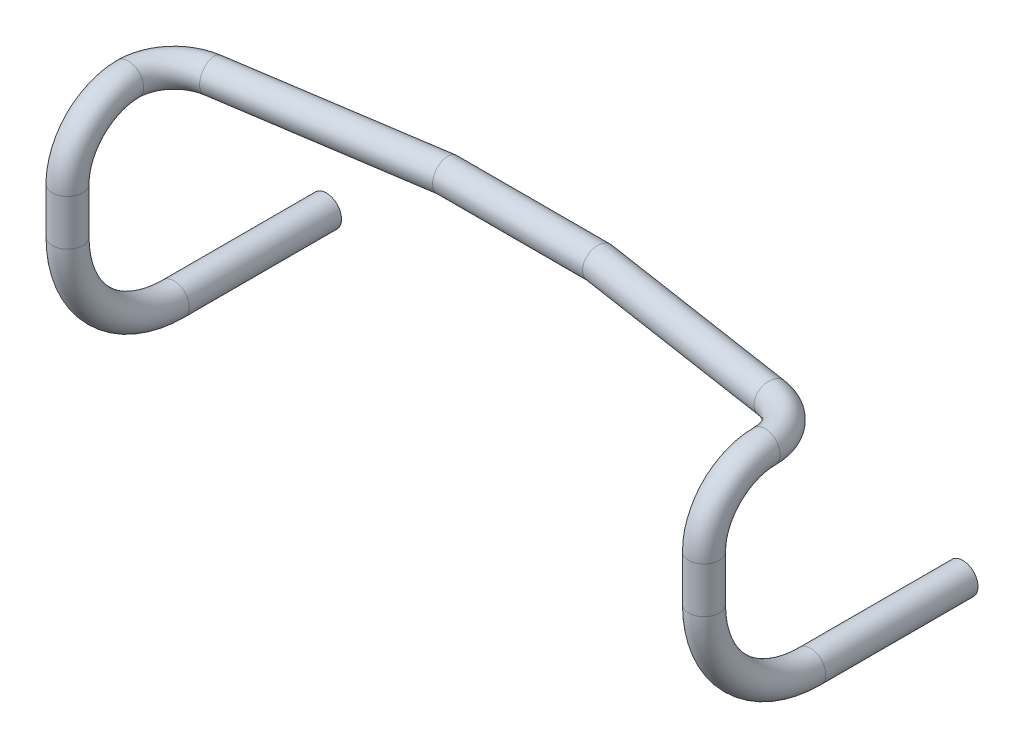
ISO-10303-21;
HEADER;
FILE_DESCRIPTION(('STEP AP214'),'2;1');
FILE_NAME('part.step','',(''),(''),'','','');
FILE_SCHEMA(('AUTOMOTIVE_DESIGN { 1 0 10303 214 1 1 1 1 }'));
ENDSEC;
DATA;
#1=APPLICATION_CONTEXT('core data for automotive mechanical design processes');
#2=APPLICATION_PROTOCOL_DEFINITION('international standard','automotive_design',2000,#1);
#3=PRODUCT_CONTEXT('',#1,'mechanical');
#4=PRODUCT('Part','Part','',(#3));
#5=PRODUCT_RELATED_PRODUCT_CATEGORY('part','',(#4));
#6=PRODUCT_DEFINITION_FORMATION('','',#4);
#7=PRODUCT_DEFINITION_CONTEXT('part definition',#1,'design');
#8=PRODUCT_DEFINITION('design','',#6,#7);
#9=PRODUCT_DEFINITION_SHAPE('','',#8);
#10=(LENGTH_UNIT() NAMED_UNIT(*) SI_UNIT(.MILLI.,.METRE.));
#11=(NAMED_UNIT(*) PLANE_ANGLE_UNIT() SI_UNIT($,.RADIAN.));
#12=(NAMED_UNIT(*) SI_UNIT($,.STERADIAN.) SOLID_ANGLE_UNIT());
#13=UNCERTAINTY_MEASURE_WITH_UNIT(LENGTH_MEASURE(1.E-05),#10,'distance_accuracy_value','');
#14=(GEOMETRIC_REPRESENTATION_CONTEXT(3) GLOBAL_UNCERTAINTY_ASSIGNED_CONTEXT((#13)) GLOBAL_UNIT_ASSIGNED_CONTEXT((#10,
#11,#12)) REPRESENTATION_CONTEXT('',''));
#15=CARTESIAN_POINT('',(0.,0.,0.));
#16=DIRECTION('',(0.,0.,1.));
#17=DIRECTION('',(1.,0.,0.));
#18=AXIS2_PLACEMENT_3D('',#15,#16,#17);
#19=CARTESIAN_POINT('',(-209.045449603669,-140.,-80.));
#20=DIRECTION('',(0.,0.,1.));
#21=DIRECTION('',(1.,0.,0.));
#22=AXIS2_PLACEMENT_3D('',#19,#20,#21);
#23=PLANE('',#22);
#24=CARTESIAN_POINT('',(-209.045449603669,-140.,-80.));
#25=DIRECTION('',(0.,0.,1.));
#26=DIRECTION('',(1.,0.,0.));
#27=AXIS2_PLACEMENT_3D('',#24,#25,#26);
#28=CIRCLE('',#27,10.);
#29=CARTESIAN_POINT('',(-199.045449603669,-140.,-80.));
#30=VERTEX_POINT('',#29);
#31=EDGE_CURVE('E51',#30,#30,#28,.T.);
#32=ORIENTED_EDGE('',*,*,#31,.F.);
#33=EDGE_LOOP('',(#32));
#34=FACE_BOUND('',#33,.T.);
#35=ADVANCED_FACE('F37',(#34),#23,.F.);
#36=CARTESIAN_POINT('',(209.045449603669,-140.,-80.));
#37=DIRECTION('',(0.,0.,-1.));
#38=DIRECTION('',(-1.,0.,0.));
#39=AXIS2_PLACEMENT_3D('',#36,#37,#38);
#40=PLANE('',#39);
#41=CARTESIAN_POINT('',(209.045449603669,-140.,-80.));
#42=DIRECTION('',(0.,0.,-1.));
#43=DIRECTION('',(-1.,0.,0.));
#44=AXIS2_PLACEMENT_3D('',#41,#42,#43);
#45=CIRCLE('',#44,10.);
#46=CARTESIAN_POINT('',(199.045449603669,-140.,-80.));
#47=VERTEX_POINT('',#46);
#48=EDGE_CURVE('E11',#47,#47,#45,.T.);
#49=ORIENTED_EDGE('',*,*,#48,.T.);
#50=EDGE_LOOP('',(#49));
#51=FACE_BOUND('',#50,.T.);
#52=ADVANCED_FACE('F65',(#51),#40,.T.);
#53=CARTESIAN_POINT('',(-49.0777687720046,0.,-0.140458876197097));
#54=DIRECTION('',(-0.988599802439453,0.,0.150567030311003));
#55=DIRECTION('',(0.150567030311003,0.,0.988599802439453));
#56=AXIS2_PLACEMENT_3D('',#53,#54,#55);
#57=CYLINDRICAL_SURFACE('',#56,10.);
#58=CARTESIAN_POINT('',(-50.,0.,0.));
#59=DIRECTION('',(-0.997145877602533,0.,0.0754989985382158));
#60=DIRECTION('',(-0.0754989985382158,0.,-0.997145877602533));
#61=AXIS2_PLACEMENT_3D('',#58,#59,#60);
#62=ELLIPSE('',#61,10.028622917284,10.);
#63=CARTESIAN_POINT('',(-50.7571509869723,0.,-10.));
#64=VERTEX_POINT('',#63);
#65=EDGE_CURVE('E56',#64,#64,#62,.T.);
#66=ORIENTED_EDGE('',*,*,#65,.T.);
#67=EDGE_LOOP('',(#66));
#68=FACE_BOUND('',#67,.T.);
#69=CARTESIAN_POINT('',(-183.562460512999,0.,20.3420059268164));
#70=DIRECTION('',(0.988599802439453,0.,-0.150567030311003));
#71=DIRECTION('',(0.150567030311003,0.,0.988599802439453));
#72=AXIS2_PLACEMENT_3D('',#69,#70,#71);
#73=CIRCLE('',#72,10.);
#74=CARTESIAN_POINT('',(-185.068130816109,0.,10.4560079024219));
#75=VERTEX_POINT('',#74);
#76=EDGE_CURVE('E40',#75,#75,#73,.T.);
#77=ORIENTED_EDGE('',*,*,#76,.T.);
#78=EDGE_LOOP('',(#77));
#79=FACE_BOUND('',#78,.T.);
#80=ADVANCED_FACE('F67',(#68,#79),#57,.T.);
#81=CARTESIAN_POINT('',(-179.045449603669,0.,50.));
#82=DIRECTION('',(0.,1.,0.));
#83=DIRECTION('',(0.,0.,1.));
#84=AXIS2_PLACEMENT_3D('',#81,#82,#83);
#85=TOROIDAL_SURFACE('',#84,30.,10.);
#86=CARTESIAN_POINT('',(-209.045449603669,0.,50.));
#87=DIRECTION('',(0.,0.,-1.));
#88=DIRECTION('',(1.,0.,0.));
#89=AXIS2_PLACEMENT_3D('',#86,#87,#88);
#90=CIRCLE('',#89,10.);
#91=CARTESIAN_POINT('',(-219.045449603669,0.,50.));
#92=VERTEX_POINT('',#91);
#93=EDGE_CURVE('E118',#92,#92,#90,.T.);
#94=CARTESIAN_POINT('',(-179.045449603669,0.,50.));
#95=DIRECTION('',(0.,1.,0.));
#96=DIRECTION('',(0.,0.,1.));
#97=AXIS2_PLACEMENT_3D('',#94,#95,#96);
#98=CIRCLE('',#97,40.);
#99=EDGE_CURVE('',#75,#92,#98,.T.);
#100=ORIENTED_EDGE('',*,*,#76,.F.);
#101=ORIENTED_EDGE('',*,*,#93,.T.);
#102=ORIENTED_EDGE('',*,*,#99,.T.);
#103=ORIENTED_EDGE('',*,*,#99,.F.);
#104=EDGE_LOOP('',(#100,#102,#101,#103));
#105=FACE_BOUND('',#104,.T.);
#106=ADVANCED_FACE('F72',(#105),#85,.T.);
#107=CARTESIAN_POINT('',(-209.045449603669,-40.,50.));
#108=DIRECTION('',(1.,0.,0.));
#109=DIRECTION('',(0.,0.,-1.));
#110=AXIS2_PLACEMENT_3D('',#107,#108,#109);
#111=TOROIDAL_SURFACE('',#110,40.,10.);
#112=CARTESIAN_POINT('',(-209.045449603669,-40.,90.));
#113=DIRECTION('',(0.,1.,0.));
#114=DIRECTION('',(1.,0.,0.));
#115=AXIS2_PLACEMENT_3D('',#112,#113,#114);
#116=CIRCLE('',#115,10.);
#117=CARTESIAN_POINT('',(-199.045449603669,-40.,90.));
#118=VERTEX_POINT('',#117);
#119=EDGE_CURVE('E124',#118,#118,#116,.T.);
#120=ORIENTED_EDGE('',*,*,#119,.T.);
#121=EDGE_LOOP('',(#120));
#122=FACE_BOUND('',#121,.T.);
#123=ORIENTED_EDGE('',*,*,#93,.F.);
#124=EDGE_LOOP('',(#123));
#125=FACE_BOUND('',#124,.T.);
#126=ADVANCED_FACE('F106',(#122,#125),#111,.T.);
#127=CARTESIAN_POINT('',(-209.045449603669,-40.,90.));
#128=DIRECTION('',(0.,-1.,0.));
#129=DIRECTION('',(0.,0.,-1.));
#130=AXIS2_PLACEMENT_3D('',#127,#128,#129);
#131=CYLINDRICAL_SURFACE('',#130,10.);
#132=CARTESIAN_POINT('',(-209.045449603669,-69.9999999999999,90.));
#133=DIRECTION('',(0.,1.,0.));
#134=DIRECTION('',(1.,0.,0.));
#135=AXIS2_PLACEMENT_3D('',#132,#133,#134);
#136=CIRCLE('',#135,10.);
#137=CARTESIAN_POINT('',(-209.045449603669,-69.9999999999999,100.));
#138=VERTEX_POINT('',#137);
#139=EDGE_CURVE('E126',#138,#138,#136,.T.);
#140=ORIENTED_EDGE('',*,*,#139,.T.);
#141=EDGE_LOOP('',(#140));
#142=FACE_BOUND('',#141,.T.);
#143=ORIENTED_EDGE('',*,*,#119,.F.);
#144=EDGE_LOOP('',(#143));
#145=FACE_BOUND('',#144,.T.);
#146=ADVANCED_FACE('F102',(#142,#145),#131,.T.);
#147=CARTESIAN_POINT('',(-209.045449603669,-69.9999999999999,20.));
#148=DIRECTION('',(1.,0.,0.));
#149=DIRECTION('',(0.,0.,-1.));
#150=AXIS2_PLACEMENT_3D('',#147,#148,#149);
#151=TOROIDAL_SURFACE('',#150,70.,10.);
#152=CARTESIAN_POINT('',(-209.045449603669,-140.,20.0000000000001));
#153=DIRECTION('',(0.,0.,1.));
#154=DIRECTION('',(1.,0.,0.));
#155=AXIS2_PLACEMENT_3D('',#152,#153,#154);
#156=CIRCLE('',#155,10.);
#157=CARTESIAN_POINT('',(-209.045449603669,-150.,20.0000000000001));
#158=VERTEX_POINT('',#157);
#159=EDGE_CURVE('E131',#158,#158,#156,.T.);
#160=CARTESIAN_POINT('',(-209.045449603669,-69.9999999999999,20.));
#161=DIRECTION('',(1.,0.,0.));
#162=DIRECTION('',(0.,0.,-1.));
#163=AXIS2_PLACEMENT_3D('',#160,#161,#162);
#164=CIRCLE('',#163,80.);
#165=EDGE_CURVE('',#138,#158,#164,.T.);
#166=ORIENTED_EDGE('',*,*,#139,.F.);
#167=ORIENTED_EDGE('',*,*,#159,.T.);
#168=ORIENTED_EDGE('',*,*,#165,.T.);
#169=ORIENTED_EDGE('',*,*,#165,.F.);
#170=EDGE_LOOP('',(#166,#168,#167,#169));
#171=FACE_BOUND('',#170,.T.);
#172=ADVANCED_FACE('F99',(#171),#151,.T.);
#173=CARTESIAN_POINT('',(-209.045449603669,-140.,19.9999999999999));
#174=DIRECTION('',(0.,0.,-1.));
#175=DIRECTION('',(0.,1.,0.));
#176=AXIS2_PLACEMENT_3D('',#173,#174,#175);
#177=CYLINDRICAL_SURFACE('',#176,10.);
#178=ORIENTED_EDGE('',*,*,#31,.T.);
#179=EDGE_LOOP('',(#178));
#180=FACE_BOUND('',#179,.T.);
#181=ORIENTED_EDGE('',*,*,#159,.F.);
#182=EDGE_LOOP('',(#181));
#183=FACE_BOUND('',#182,.T.);
#184=ADVANCED_FACE('F95',(#180,#183),#177,.T.);
#185=CARTESIAN_POINT('',(50.9328660856696,0.,0.));
#186=DIRECTION('',(-1.,0.,0.));
#187=DIRECTION('',(0.,0.,1.));
#188=AXIS2_PLACEMENT_3D('',#185,#186,#187);
#189=CYLINDRICAL_SURFACE('',#188,10.);
#190=CARTESIAN_POINT('',(50.,0.,0.));
#191=DIRECTION('',(-0.997145877602533,0.,-0.0754989985382158));
#192=DIRECTION('',(0.0754989985382158,0.,-0.997145877602533));
#193=AXIS2_PLACEMENT_3D('',#190,#191,#192);
#194=ELLIPSE('',#193,10.028622917284,10.);
#195=CARTESIAN_POINT('',(50.7571509869724,0.,-10.));
#196=VERTEX_POINT('',#195);
#197=EDGE_CURVE('E122',#196,#196,#194,.T.);
#198=ORIENTED_EDGE('',*,*,#197,.T.);
#199=EDGE_LOOP('',(#198));
#200=FACE_BOUND('',#199,.T.);
#201=ORIENTED_EDGE('',*,*,#65,.F.);
#202=EDGE_LOOP('',(#201));
#203=FACE_BOUND('',#202,.T.);
#204=ADVANCED_FACE('F92',(#200,#203),#189,.T.);
#205=CARTESIAN_POINT('',(209.045449603669,-140.,-80.));
#206=DIRECTION('',(0.,0.,1.));
#207=DIRECTION('',(0.,-1.,0.));
#208=AXIS2_PLACEMENT_3D('',#205,#206,#207);
#209=CYLINDRICAL_SURFACE('',#208,10.);
#210=CARTESIAN_POINT('',(209.045449603669,-140.,20.));
#211=DIRECTION('',(0.,0.,-1.));
#212=DIRECTION('',(-1.,0.,0.));
#213=AXIS2_PLACEMENT_3D('',#210,#211,#212);
#214=CIRCLE('',#213,10.);
#215=CARTESIAN_POINT('',(209.045449603669,-150.,19.9999999999999));
#216=VERTEX_POINT('',#215);
#217=EDGE_CURVE('E45',#216,#216,#214,.T.);
#218=ORIENTED_EDGE('',*,*,#217,.T.);
#219=EDGE_LOOP('',(#218));
#220=FACE_BOUND('',#219,.T.);
#221=ORIENTED_EDGE('',*,*,#48,.F.);
#222=EDGE_LOOP('',(#221));
#223=FACE_BOUND('',#222,.T.);
#224=ADVANCED_FACE('F63',(#220,#223),#209,.T.);
#225=CARTESIAN_POINT('',(209.045449603669,-69.9999999999999,20.));
#226=DIRECTION('',(-1.,0.,0.));
#227=DIRECTION('',(0.,0.,1.));
#228=AXIS2_PLACEMENT_3D('',#225,#226,#227);
#229=TOROIDAL_SURFACE('',#228,70.,10.);
#230=CARTESIAN_POINT('',(209.045449603669,-69.9999999999999,90.));
#231=DIRECTION('',(0.,-1.,0.));
#232=DIRECTION('',(-1.,0.,0.));
#233=AXIS2_PLACEMENT_3D('',#230,#231,#232);
#234=CIRCLE('',#233,10.);
#235=CARTESIAN_POINT('',(209.045449603669,-69.9999999999999,100.));
#236=VERTEX_POINT('',#235);
#237=EDGE_CURVE('E140',#236,#236,#234,.T.);
#238=CARTESIAN_POINT('',(209.045449603669,-69.9999999999999,20.));
#239=DIRECTION('',(-1.,0.,0.));
#240=DIRECTION('',(0.,0.,1.));
#241=AXIS2_PLACEMENT_3D('',#238,#239,#240);
#242=CIRCLE('',#241,80.);
#243=EDGE_CURVE('',#216,#236,#242,.T.);
#244=ORIENTED_EDGE('',*,*,#217,.F.);
#245=ORIENTED_EDGE('',*,*,#237,.T.);
#246=ORIENTED_EDGE('',*,*,#243,.T.);
#247=ORIENTED_EDGE('',*,*,#243,.F.);
#248=EDGE_LOOP('',(#244,#246,#245,#247));
#249=FACE_BOUND('',#248,.T.);
#250=ADVANCED_FACE('F161',(#249),#229,.T.);
#251=CARTESIAN_POINT('',(209.045449603669,-69.9999999999999,90.));
#252=DIRECTION('',(0.,1.,0.));
#253=DIRECTION('',(0.,0.,1.));
#254=AXIS2_PLACEMENT_3D('',#251,#252,#253);
#255=CYLINDRICAL_SURFACE('',#254,10.);
#256=CARTESIAN_POINT('',(209.045449603669,-40.,90.));
#257=DIRECTION('',(0.,-1.,0.));
#258=DIRECTION('',(-1.,0.,0.));
#259=AXIS2_PLACEMENT_3D('',#256,#257,#258);
#260=CIRCLE('',#259,10.);
#261=CARTESIAN_POINT('',(209.045449603669,-40.,100.));
#262=VERTEX_POINT('',#261);
#263=EDGE_CURVE('E143',#262,#262,#260,.T.);
#264=ORIENTED_EDGE('',*,*,#263,.T.);
#265=EDGE_LOOP('',(#264));
#266=FACE_BOUND('',#265,.T.);
#267=ORIENTED_EDGE('',*,*,#237,.F.);
#268=EDGE_LOOP('',(#267));
#269=FACE_BOUND('',#268,.T.);
#270=ADVANCED_FACE('F155',(#266,#269),#255,.T.);
#271=CARTESIAN_POINT('',(209.045449603669,-40.,50.));
#272=DIRECTION('',(-1.,0.,0.));
#273=DIRECTION('',(0.,0.,1.));
#274=AXIS2_PLACEMENT_3D('',#271,#272,#273);
#275=TOROIDAL_SURFACE('',#274,40.,10.);
#276=CARTESIAN_POINT('',(209.045449603669,0.,50.));
#277=DIRECTION('',(0.,0.,1.));
#278=DIRECTION('',(-1.,0.,0.));
#279=AXIS2_PLACEMENT_3D('',#276,#277,#278);
#280=CIRCLE('',#279,10.);
#281=CARTESIAN_POINT('',(209.045449603669,10.,49.9999999999999));
#282=VERTEX_POINT('',#281);
#283=EDGE_CURVE('E146',#282,#282,#280,.T.);
#284=CARTESIAN_POINT('',(209.045449603669,-40.,50.));
#285=DIRECTION('',(-1.,0.,0.));
#286=DIRECTION('',(0.,0.,1.));
#287=AXIS2_PLACEMENT_3D('',#284,#285,#286);
#288=CIRCLE('',#287,50.);
#289=EDGE_CURVE('',#262,#282,#288,.T.);
#290=ORIENTED_EDGE('',*,*,#263,.F.);
#291=ORIENTED_EDGE('',*,*,#283,.T.);
#292=ORIENTED_EDGE('',*,*,#289,.T.);
#293=ORIENTED_EDGE('',*,*,#289,.F.);
#294=EDGE_LOOP('',(#290,#292,#291,#293));
#295=FACE_BOUND('',#294,.T.);
#296=ADVANCED_FACE('F84',(#295),#275,.T.);
#297=CARTESIAN_POINT('',(179.045449603669,0.,50.));
#298=DIRECTION('',(0.,1.,0.));
#299=DIRECTION('',(0.,0.,1.));
#300=AXIS2_PLACEMENT_3D('',#297,#298,#299);
#301=TOROIDAL_SURFACE('',#300,30.,10.);
#302=CARTESIAN_POINT('',(183.562460512999,0.,20.3420059268164));
#303=DIRECTION('',(0.988599802439453,0.,0.150567030311005));
#304=DIRECTION('',(-0.150567030311005,0.,0.988599802439453));
#305=AXIS2_PLACEMENT_3D('',#302,#303,#304);
#306=CIRCLE('',#305,10.);
#307=CARTESIAN_POINT('',(182.056790209889,0.,30.2280039512109));
#308=VERTEX_POINT('',#307);
#309=EDGE_CURVE('E136',#308,#308,#306,.T.);
#310=ORIENTED_EDGE('',*,*,#309,.T.);
#311=EDGE_LOOP('',(#310));
#312=FACE_BOUND('',#311,.T.);
#313=ORIENTED_EDGE('',*,*,#283,.F.);
#314=EDGE_LOOP('',(#313));
#315=FACE_BOUND('',#314,.T.);
#316=ADVANCED_FACE('F78',(#312,#315),#301,.T.);
#317=CARTESIAN_POINT('',(183.562460512999,0.,20.3420059268164));
#318=DIRECTION('',(-0.988599802439453,0.,-0.150567030311003));
#319=DIRECTION('',(-0.150567030311003,0.,0.988599802439453));
#320=AXIS2_PLACEMENT_3D('',#317,#318,#319);
#321=CYLINDRICAL_SURFACE('',#320,10.);
#322=ORIENTED_EDGE('',*,*,#309,.F.);
#323=EDGE_LOOP('',(#322));
#324=FACE_BOUND('',#323,.T.);
#325=ORIENTED_EDGE('',*,*,#197,.F.);
#326=EDGE_LOOP('',(#325));
#327=FACE_BOUND('',#326,.T.);
#328=ADVANCED_FACE('F76',(#324,#327),#321,.T.);
#329=CLOSED_SHELL('',(#35,#52,#80,#106,#126,#146,#172,#184,#204,#224,#250,#270,#296,#316,#328));
#330=MANIFOLD_SOLID_BREP('B2',#329);
#331=ADVANCED_BREP_SHAPE_REPRESENTATION('',(#18,#330),#14);
#332=SHAPE_DEFINITION_REPRESENTATION(#9,#331);
ENDSEC;
END-ISO-10303-21;
